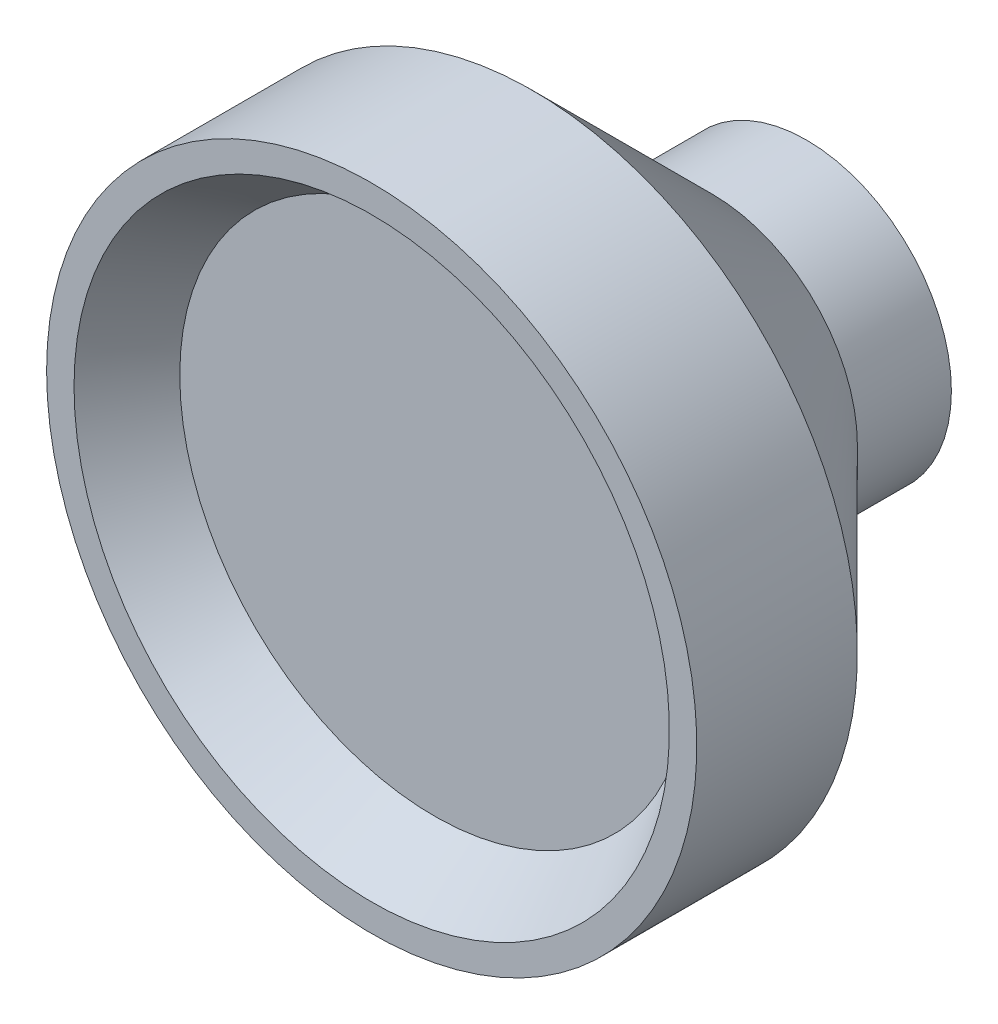
ISO-10303-21;
HEADER;
FILE_DESCRIPTION(('STEP AP214'),'2;1');
FILE_NAME('part.step','',(''),(''),'','','');
FILE_SCHEMA(('AUTOMOTIVE_DESIGN { 1 0 10303 214 1 1 1 1 }'));
ENDSEC;
DATA;
#1=APPLICATION_CONTEXT('core data for automotive mechanical design processes');
#2=APPLICATION_PROTOCOL_DEFINITION('international standard','automotive_design',2000,#1);
#3=PRODUCT_CONTEXT('',#1,'mechanical');
#4=PRODUCT('Part','Part','',(#3));
#5=PRODUCT_RELATED_PRODUCT_CATEGORY('part','',(#4));
#6=PRODUCT_DEFINITION_FORMATION('','',#4);
#7=PRODUCT_DEFINITION_CONTEXT('part definition',#1,'design');
#8=PRODUCT_DEFINITION('design','',#6,#7);
#9=PRODUCT_DEFINITION_SHAPE('','',#8);
#10=(LENGTH_UNIT() NAMED_UNIT(*) SI_UNIT(.MILLI.,.METRE.));
#11=(NAMED_UNIT(*) PLANE_ANGLE_UNIT() SI_UNIT($,.RADIAN.));
#12=(NAMED_UNIT(*) SI_UNIT($,.STERADIAN.) SOLID_ANGLE_UNIT());
#13=UNCERTAINTY_MEASURE_WITH_UNIT(LENGTH_MEASURE(1.E-05),#10,'distance_accuracy_value','');
#14=(GEOMETRIC_REPRESENTATION_CONTEXT(3) GLOBAL_UNCERTAINTY_ASSIGNED_CONTEXT((#13)) GLOBAL_UNIT_ASSIGNED_CONTEXT((#10,
#11,#12)) REPRESENTATION_CONTEXT('',''));
#15=CARTESIAN_POINT('',(0.,0.,0.));
#16=DIRECTION('',(0.,0.,1.));
#17=DIRECTION('',(1.,0.,0.));
#18=AXIS2_PLACEMENT_3D('',#15,#16,#17);
#19=CARTESIAN_POINT('',(0.,0.,4.));
#20=DIRECTION('',(0.,0.,-1.));
#21=DIRECTION('',(-1.,0.,0.));
#22=AXIS2_PLACEMENT_3D('',#19,#20,#21);
#23=CYLINDRICAL_SURFACE('',#22,3.);
#24=CARTESIAN_POINT('',(0.,0.,4.));
#25=DIRECTION('',(0.,0.,1.));
#26=DIRECTION('',(-1.,0.,0.));
#27=AXIS2_PLACEMENT_3D('',#24,#25,#26);
#28=CIRCLE('',#27,3.);
#29=CARTESIAN_POINT('',(-3.,0.,4.));
#30=VERTEX_POINT('',#29);
#31=EDGE_CURVE('E21',#30,#30,#28,.T.);
#32=ORIENTED_EDGE('',*,*,#31,.T.);
#33=DIRECTION('',(0.,0.,-1.));
#34=VECTOR('',#33,1.);
#35=CARTESIAN_POINT('',(-3.,0.,4.));
#36=LINE('',#35,#34);
#37=CARTESIAN_POINT('',(-3.,0.,0.));
#38=VERTEX_POINT('',#37);
#39=EDGE_CURVE('E11',#30,#38,#36,.T.);
#40=ORIENTED_EDGE('',*,*,#39,.T.);
#41=CARTESIAN_POINT('',(0.,0.,0.));
#42=DIRECTION('',(0.,0.,1.));
#43=DIRECTION('',(-1.,0.,0.));
#44=AXIS2_PLACEMENT_3D('',#41,#42,#43);
#45=CIRCLE('',#44,3.);
#46=EDGE_CURVE('E66',#38,#38,#45,.T.);
#47=ORIENTED_EDGE('',*,*,#46,.F.);
#48=ORIENTED_EDGE('',*,*,#39,.F.);
#49=EDGE_LOOP('',(#32,#40,#47,#48));
#50=FACE_BOUND('',#49,.T.);
#51=ADVANCED_FACE('F18',(#50),#23,.F.);
#52=CARTESIAN_POINT('',(0.,0.,4.));
#53=DIRECTION('',(0.,0.,1.));
#54=DIRECTION('',(0.,-1.,0.));
#55=AXIS2_PLACEMENT_3D('',#52,#53,#54);
#56=PLANE('',#55);
#57=ORIENTED_EDGE('',*,*,#31,.F.);
#58=EDGE_LOOP('',(#57));
#59=FACE_BOUND('',#58,.T.);
#60=ADVANCED_FACE('F180',(#59),#56,.F.);
#61=CARTESIAN_POINT('',(0.,0.,9.5));
#62=DIRECTION('',(0.,0.,1.));
#63=DIRECTION('',(0.,-1.,0.));
#64=AXIS2_PLACEMENT_3D('',#61,#62,#63);
#65=PLANE('',#64);
#66=CARTESIAN_POINT('',(0.,0.,9.5));
#67=DIRECTION('',(0.,0.,1.));
#68=DIRECTION('',(-1.,0.,0.));
#69=AXIS2_PLACEMENT_3D('',#66,#67,#68);
#70=CIRCLE('',#69,6.5);
#71=CARTESIAN_POINT('',(-6.5,0.,9.5));
#72=VERTEX_POINT('',#71);
#73=EDGE_CURVE('E42',#72,#72,#70,.T.);
#74=ORIENTED_EDGE('',*,*,#73,.T.);
#75=EDGE_LOOP('',(#74));
#76=FACE_BOUND('',#75,.T.);
#77=ADVANCED_FACE('F169',(#76),#65,.T.);
#78=CARTESIAN_POINT('',(0.,0.,11.1));
#79=DIRECTION('',(0.,0.,1.));
#80=DIRECTION('',(-1.,0.,0.));
#81=AXIS2_PLACEMENT_3D('',#78,#79,#80);
#82=CONICAL_SURFACE('',#81,7.6,0.602287346135);
#83=CARTESIAN_POINT('',(0.,0.,11.1));
#84=DIRECTION('',(0.,0.,1.));
#85=DIRECTION('',(-1.,0.,0.));
#86=AXIS2_PLACEMENT_3D('',#83,#84,#85);
#87=CIRCLE('',#86,7.6);
#88=CARTESIAN_POINT('',(-7.6,0.,11.1));
#89=VERTEX_POINT('',#88);
#90=EDGE_CURVE('E95',#89,#89,#87,.T.);
#91=ORIENTED_EDGE('',*,*,#90,.T.);
#92=DIRECTION('',(0.566528822887193,0.,-0.82404192419928));
#93=VECTOR('',#92,1.);
#94=CARTESIAN_POINT('',(-7.6,0.,11.1));
#95=LINE('',#94,#93);
#96=EDGE_CURVE('E86',#89,#72,#95,.T.);
#97=ORIENTED_EDGE('',*,*,#96,.T.);
#98=ORIENTED_EDGE('',*,*,#73,.F.);
#99=ORIENTED_EDGE('',*,*,#96,.F.);
#100=EDGE_LOOP('',(#91,#97,#98,#99));
#101=FACE_BOUND('',#100,.T.);
#102=ADVANCED_FACE('F157',(#101),#82,.F.);
#103=CARTESIAN_POINT('',(0.,0.,11.1));
#104=DIRECTION('',(0.,0.,1.));
#105=DIRECTION('',(0.,-1.,0.));
#106=AXIS2_PLACEMENT_3D('',#103,#104,#105);
#107=PLANE('',#106);
#108=ORIENTED_EDGE('',*,*,#90,.F.);
#109=EDGE_LOOP('',(#108));
#110=FACE_BOUND('',#109,.T.);
#111=CARTESIAN_POINT('',(0.,0.,11.1));
#112=DIRECTION('',(0.,0.,1.));
#113=DIRECTION('',(-1.,0.,0.));
#114=AXIS2_PLACEMENT_3D('',#111,#112,#113);
#115=CIRCLE('',#114,8.3);
#116=CARTESIAN_POINT('',(-8.3,0.,11.1));
#117=VERTEX_POINT('',#116);
#118=EDGE_CURVE('E83',#117,#117,#115,.T.);
#119=ORIENTED_EDGE('',*,*,#118,.T.);
#120=EDGE_LOOP('',(#119));
#121=FACE_BOUND('',#120,.T.);
#122=ADVANCED_FACE('F133',(#110,#121),#107,.T.);
#123=CARTESIAN_POINT('',(0.,0.,7.));
#124=DIRECTION('',(0.,0.,1.));
#125=DIRECTION('',(-1.,0.,0.));
#126=AXIS2_PLACEMENT_3D('',#123,#124,#125);
#127=CYLINDRICAL_SURFACE('',#126,8.3);
#128=CARTESIAN_POINT('',(0.,0.,7.));
#129=DIRECTION('',(0.,0.,1.));
#130=DIRECTION('',(-1.,0.,0.));
#131=AXIS2_PLACEMENT_3D('',#128,#129,#130);
#132=CIRCLE('',#131,8.3);
#133=CARTESIAN_POINT('',(-8.3,0.,7.));
#134=VERTEX_POINT('',#133);
#135=EDGE_CURVE('E88',#134,#134,#132,.T.);
#136=ORIENTED_EDGE('',*,*,#135,.T.);
#137=DIRECTION('',(0.,0.,1.));
#138=VECTOR('',#137,1.);
#139=CARTESIAN_POINT('',(-8.3,0.,7.));
#140=LINE('',#139,#138);
#141=EDGE_CURVE('E84',#134,#117,#140,.T.);
#142=ORIENTED_EDGE('',*,*,#141,.T.);
#143=ORIENTED_EDGE('',*,*,#118,.F.);
#144=ORIENTED_EDGE('',*,*,#141,.F.);
#145=EDGE_LOOP('',(#136,#142,#143,#144));
#146=FACE_BOUND('',#145,.T.);
#147=ADVANCED_FACE('F127',(#146),#127,.T.);
#148=CARTESIAN_POINT('',(0.,0.,2.4));
#149=DIRECTION('',(0.,0.,1.));
#150=DIRECTION('',(-1.,0.,0.));
#151=AXIS2_PLACEMENT_3D('',#148,#149,#150);
#152=CONICAL_SURFACE('',#151,3.7,0.785398163397);
#153=CARTESIAN_POINT('',(0.,0.,2.4));
#154=DIRECTION('',(0.,0.,1.));
#155=DIRECTION('',(-1.,0.,0.));
#156=AXIS2_PLACEMENT_3D('',#153,#154,#155);
#157=CIRCLE('',#156,3.7);
#158=CARTESIAN_POINT('',(-3.7,0.,2.4));
#159=VERTEX_POINT('',#158);
#160=EDGE_CURVE('E92',#159,#159,#157,.T.);
#161=ORIENTED_EDGE('',*,*,#160,.T.);
#162=DIRECTION('',(-0.707106781186548,0.,0.707106781186548));
#163=VECTOR('',#162,1.);
#164=CARTESIAN_POINT('',(-3.7,0.,2.4));
#165=LINE('',#164,#163);
#166=EDGE_CURVE('E99',#159,#134,#165,.T.);
#167=ORIENTED_EDGE('',*,*,#166,.T.);
#168=ORIENTED_EDGE('',*,*,#135,.F.);
#169=ORIENTED_EDGE('',*,*,#166,.F.);
#170=EDGE_LOOP('',(#161,#167,#168,#169));
#171=FACE_BOUND('',#170,.T.);
#172=ADVANCED_FACE('F132',(#171),#152,.T.);
#173=CARTESIAN_POINT('',(0.,0.,0.));
#174=DIRECTION('',(0.,0.,1.));
#175=DIRECTION('',(-1.,0.,0.));
#176=AXIS2_PLACEMENT_3D('',#173,#174,#175);
#177=CYLINDRICAL_SURFACE('',#176,3.7);
#178=CARTESIAN_POINT('',(0.,0.,0.));
#179=DIRECTION('',(0.,0.,1.));
#180=DIRECTION('',(-1.,0.,0.));
#181=AXIS2_PLACEMENT_3D('',#178,#179,#180);
#182=CIRCLE('',#181,3.7);
#183=CARTESIAN_POINT('',(-3.7,0.,0.));
#184=VERTEX_POINT('',#183);
#185=EDGE_CURVE('E72',#184,#184,#182,.T.);
#186=ORIENTED_EDGE('',*,*,#185,.T.);
#187=DIRECTION('',(0.,0.,1.));
#188=VECTOR('',#187,1.);
#189=CARTESIAN_POINT('',(-3.7,0.,0.));
#190=LINE('',#189,#188);
#191=EDGE_CURVE('E79',#184,#159,#190,.T.);
#192=ORIENTED_EDGE('',*,*,#191,.T.);
#193=ORIENTED_EDGE('',*,*,#160,.F.);
#194=ORIENTED_EDGE('',*,*,#191,.F.);
#195=EDGE_LOOP('',(#186,#192,#193,#194));
#196=FACE_BOUND('',#195,.T.);
#197=ADVANCED_FACE('F125',(#196),#177,.T.);
#198=CARTESIAN_POINT('',(0.,0.,0.));
#199=DIRECTION('',(0.,0.,1.));
#200=DIRECTION('',(0.,-1.,0.));
#201=AXIS2_PLACEMENT_3D('',#198,#199,#200);
#202=PLANE('',#201);
#203=ORIENTED_EDGE('',*,*,#185,.F.);
#204=EDGE_LOOP('',(#203));
#205=FACE_BOUND('',#204,.T.);
#206=ORIENTED_EDGE('',*,*,#46,.T.);
#207=EDGE_LOOP('',(#206));
#208=FACE_BOUND('',#207,.T.);
#209=ADVANCED_FACE('F71',(#205,#208),#202,.F.);
#210=CLOSED_SHELL('',(#51,#60,#77,#102,#122,#147,#172,#197,#209));
#211=MANIFOLD_SOLID_BREP('B1',#210);
#212=ADVANCED_BREP_SHAPE_REPRESENTATION('',(#18,#211),#14);
#213=SHAPE_DEFINITION_REPRESENTATION(#9,#212);
ENDSEC;
END-ISO-10303-21;
